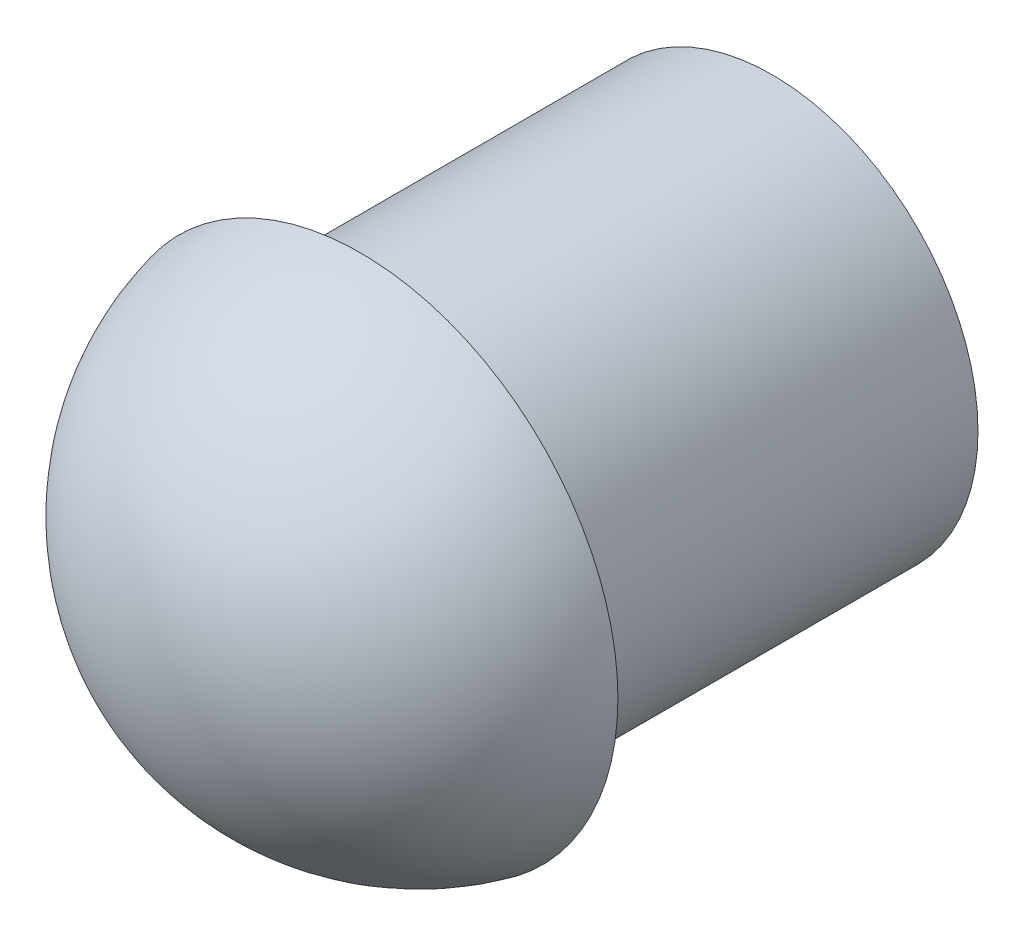
ISO-10303-21;
HEADER;
FILE_DESCRIPTION(('STEP AP214'),'2;1');
FILE_NAME('part.step','',(''),(''),'','','');
FILE_SCHEMA(('AUTOMOTIVE_DESIGN { 1 0 10303 214 1 1 1 1 }'));
ENDSEC;
DATA;
#1=APPLICATION_CONTEXT('core data for automotive mechanical design processes');
#2=APPLICATION_PROTOCOL_DEFINITION('international standard','automotive_design',2000,#1);
#3=PRODUCT_CONTEXT('',#1,'mechanical');
#4=PRODUCT('Part','Part','',(#3));
#5=PRODUCT_RELATED_PRODUCT_CATEGORY('part','',(#4));
#6=PRODUCT_DEFINITION_FORMATION('','',#4);
#7=PRODUCT_DEFINITION_CONTEXT('part definition',#1,'design');
#8=PRODUCT_DEFINITION('design','',#6,#7);
#9=PRODUCT_DEFINITION_SHAPE('','',#8);
#10=(LENGTH_UNIT() NAMED_UNIT(*) SI_UNIT(.MILLI.,.METRE.));
#11=(NAMED_UNIT(*) PLANE_ANGLE_UNIT() SI_UNIT($,.RADIAN.));
#12=(NAMED_UNIT(*) SI_UNIT($,.STERADIAN.) SOLID_ANGLE_UNIT());
#13=UNCERTAINTY_MEASURE_WITH_UNIT(LENGTH_MEASURE(1.E-05),#10,'distance_accuracy_value','');
#14=(GEOMETRIC_REPRESENTATION_CONTEXT(3) GLOBAL_UNCERTAINTY_ASSIGNED_CONTEXT((#13)) GLOBAL_UNIT_ASSIGNED_CONTEXT((#10,
#11,#12)) REPRESENTATION_CONTEXT('',''));
#15=CARTESIAN_POINT('',(0.,0.,0.));
#16=DIRECTION('',(0.,0.,1.));
#17=DIRECTION('',(1.,0.,0.));
#18=AXIS2_PLACEMENT_3D('',#15,#16,#17);
#19=CARTESIAN_POINT('',(0.,0.,40.));
#20=DIRECTION('',(0.,0.,-1.));
#21=DIRECTION('',(-1.,0.,0.));
#22=AXIS2_PLACEMENT_3D('',#19,#20,#21);
#23=CYLINDRICAL_SURFACE('',#22,20.);
#24=CARTESIAN_POINT('',(0.,0.,40.));
#25=DIRECTION('',(0.,0.,1.));
#26=DIRECTION('',(1.,0.,0.));
#27=AXIS2_PLACEMENT_3D('',#24,#25,#26);
#28=CIRCLE('',#27,20.);
#29=CARTESIAN_POINT('',(20.,0.,40.));
#30=VERTEX_POINT('',#29);
#31=EDGE_CURVE('E11',#30,#30,#28,.T.);
#32=ORIENTED_EDGE('',*,*,#31,.F.);
#33=EDGE_LOOP('',(#32));
#34=FACE_BOUND('',#33,.T.);
#35=CARTESIAN_POINT('',(0.,0.,0.));
#36=DIRECTION('',(0.,0.,1.));
#37=DIRECTION('',(1.,0.,0.));
#38=AXIS2_PLACEMENT_3D('',#35,#36,#37);
#39=CIRCLE('',#38,20.);
#40=CARTESIAN_POINT('',(20.,0.,0.));
#41=VERTEX_POINT('',#40);
#42=EDGE_CURVE('E42',#41,#41,#39,.T.);
#43=ORIENTED_EDGE('',*,*,#42,.T.);
#44=EDGE_LOOP('',(#43));
#45=FACE_BOUND('',#44,.T.);
#46=ADVANCED_FACE('F39',(#34,#45),#23,.T.);
#47=CARTESIAN_POINT('',(0.,0.,0.));
#48=DIRECTION('',(0.,0.,1.));
#49=DIRECTION('',(1.,0.,0.));
#50=AXIS2_PLACEMENT_3D('',#47,#48,#49);
#51=PLANE('',#50);
#52=ORIENTED_EDGE('',*,*,#42,.F.);
#53=EDGE_LOOP('',(#52));
#54=FACE_BOUND('',#53,.T.);
#55=ADVANCED_FACE('F65',(#54),#51,.F.);
#56=CARTESIAN_POINT('',(0.,0.,40.));
#57=DIRECTION('',(0.,0.,1.));
#58=DIRECTION('',(1.,0.,0.));
#59=AXIS2_PLACEMENT_3D('',#56,#57,#58);
#60=PLANE('',#59);
#61=ORIENTED_EDGE('',*,*,#31,.T.);
#62=EDGE_LOOP('',(#61));
#63=FACE_BOUND('',#62,.T.);
#64=CARTESIAN_POINT('',(0.,0.,40.));
#65=DIRECTION('',(0.,0.,-1.));
#66=DIRECTION('',(-1.,0.,0.));
#67=AXIS2_PLACEMENT_3D('',#64,#65,#66);
#68=CIRCLE('',#67,25.);
#69=CARTESIAN_POINT('',(-25.,0.,40.));
#70=VERTEX_POINT('',#69);
#71=EDGE_CURVE('E56',#70,#70,#68,.T.);
#72=ORIENTED_EDGE('',*,*,#71,.T.);
#73=EDGE_LOOP('',(#72));
#74=FACE_BOUND('',#73,.T.);
#75=ADVANCED_FACE('F52',(#63,#74),#60,.F.);
#76=CARTESIAN_POINT('',(0.0346207670864438,0.,34.3317240411419));
#77=DIRECTION('',(0.,-1.,0.));
#78=DIRECTION('',(-1.,0.,0.));
#79=AXIS2_PLACEMENT_3D('',#76,#77,#78);
#80=CIRCLE('',#79,25.6682993066857);
#81=TRIMMED_CURVE('',#80,(PARAMETER_VALUE(-1.56944755112535)),
(PARAMETER_VALUE(1.56944755112535)),.T.,.PARAMETER.);
#82=CARTESIAN_POINT('',(0.,0.,34.3317240411419));
#83=DIRECTION('',(0.,0.,-1.));
#84=AXIS1_PLACEMENT('',#82,#83);
#85=SURFACE_OF_REVOLUTION('',#81,#84);
#86=CARTESIAN_POINT('',(0.,0.,60.));
#87=VERTEX_POINT('',#86);
#88=VERTEX_LOOP('',#87);
#89=FACE_BOUND('',#88,.T.);
#90=ORIENTED_EDGE('',*,*,#71,.F.);
#91=EDGE_LOOP('',(#90));
#92=FACE_BOUND('',#91,.T.);
#93=ADVANCED_FACE('F49',(#89,#92),#85,.T.);
#94=CLOSED_SHELL('',(#46,#55,#75,#93));
#95=MANIFOLD_SOLID_BREP('B2',#94);
#96=ADVANCED_BREP_SHAPE_REPRESENTATION('',(#18,#95),#14);
#97=SHAPE_DEFINITION_REPRESENTATION(#9,#96);
ENDSEC;
END-ISO-10303-21;
